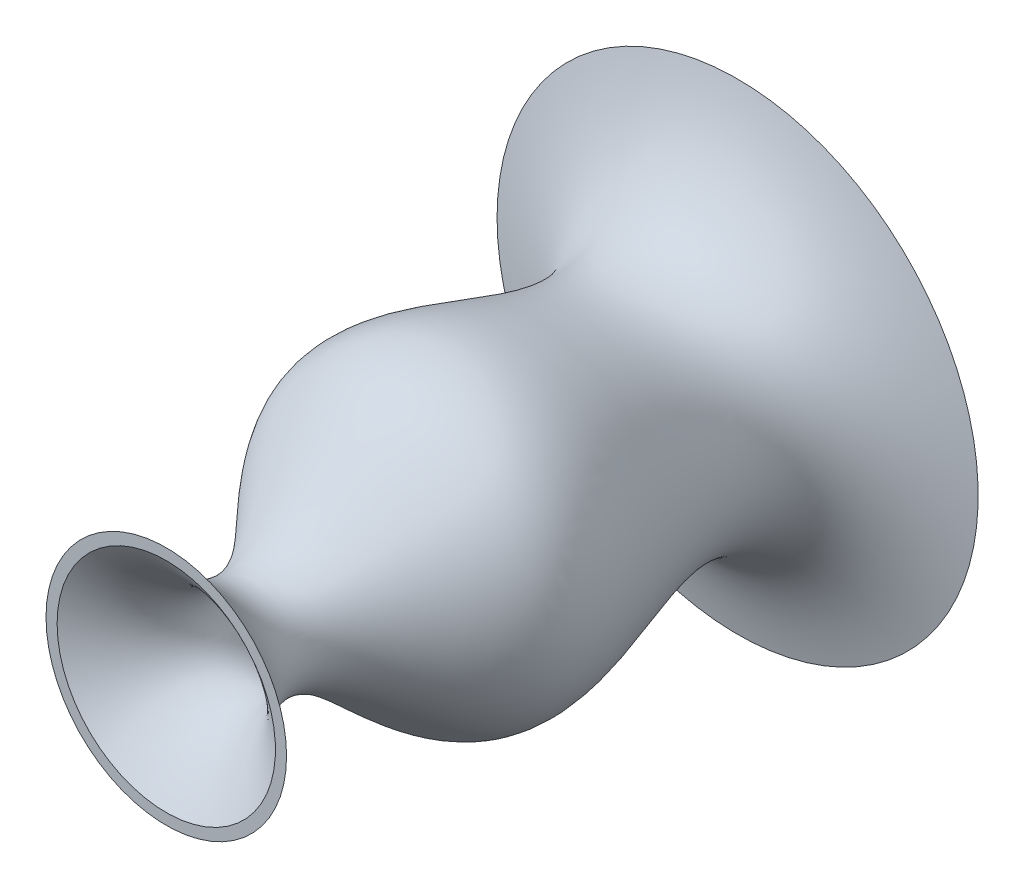
ISO-10303-21;
HEADER;
FILE_DESCRIPTION(('STEP AP214'),'2;1');
FILE_NAME('part.step','',(''),(''),'','','');
FILE_SCHEMA(('AUTOMOTIVE_DESIGN { 1 0 10303 214 1 1 1 1 }'));
ENDSEC;
DATA;
#1=APPLICATION_CONTEXT('core data for automotive mechanical design processes');
#2=APPLICATION_PROTOCOL_DEFINITION('international standard','automotive_design',2000,#1);
#3=PRODUCT_CONTEXT('',#1,'mechanical');
#4=PRODUCT('Part','Part','',(#3));
#5=PRODUCT_RELATED_PRODUCT_CATEGORY('part','',(#4));
#6=PRODUCT_DEFINITION_FORMATION('','',#4);
#7=PRODUCT_DEFINITION_CONTEXT('part definition',#1,'design');
#8=PRODUCT_DEFINITION('design','',#6,#7);
#9=PRODUCT_DEFINITION_SHAPE('','',#8);
#10=(LENGTH_UNIT() NAMED_UNIT(*) SI_UNIT(.MILLI.,.METRE.));
#11=(NAMED_UNIT(*) PLANE_ANGLE_UNIT() SI_UNIT($,.RADIAN.));
#12=(NAMED_UNIT(*) SI_UNIT($,.STERADIAN.) SOLID_ANGLE_UNIT());
#13=UNCERTAINTY_MEASURE_WITH_UNIT(LENGTH_MEASURE(1.E-05),#10,'distance_accuracy_value','');
#14=(GEOMETRIC_REPRESENTATION_CONTEXT(3) GLOBAL_UNCERTAINTY_ASSIGNED_CONTEXT((#13)) GLOBAL_UNIT_ASSIGNED_CONTEXT((#10,
#11,#12)) REPRESENTATION_CONTEXT('',''));
#15=CARTESIAN_POINT('',(0.,0.,0.));
#16=DIRECTION('',(0.,0.,1.));
#17=DIRECTION('',(1.,0.,0.));
#18=AXIS2_PLACEMENT_3D('',#15,#16,#17);
#19=CARTESIAN_POINT('',(0.,50.8,241.3));
#20=CARTESIAN_POINT('',(0.,-17.1723162395063,198.708109588688));
#21=CARTESIAN_POINT('',(0.,140.989603279236,144.448815338189));
#22=CARTESIAN_POINT('',(0.,-0.614962808046618,24.6496374591642));
#23=CARTESIAN_POINT('',(0.,101.6,0.));
#24=B_SPLINE_CURVE_WITH_KNOTS('',3,(#19,#20,#21,#22,#23),.UNSPECIFIED.,.F.,.F.,(4,1,4),(0.,
0.431374722332997,1.),.UNSPECIFIED.);
#25=CARTESIAN_POINT('',(0.,0.,0.));
#26=DIRECTION('',(0.,0.,-1.));
#27=AXIS1_PLACEMENT('',#25,#26);
#28=SURFACE_OF_REVOLUTION('',#24,#27);
#29=CARTESIAN_POINT('',(0.,0.,0.));
#30=DIRECTION('',(0.,0.,-1.));
#31=DIRECTION('',(-1.,0.,0.));
#32=AXIS2_PLACEMENT_3D('',#29,#30,#31);
#33=CIRCLE('',#32,101.6);
#34=CARTESIAN_POINT('',(-101.6,0.,0.));
#35=VERTEX_POINT('',#34);
#36=EDGE_CURVE('E51',#35,#35,#33,.T.);
#37=ORIENTED_EDGE('',*,*,#36,.F.);
#38=EDGE_LOOP('',(#37));
#39=FACE_BOUND('',#38,.T.);
#40=CARTESIAN_POINT('',(0.,0.,241.3));
#41=DIRECTION('',(0.,0.,-1.));
#42=DIRECTION('',(-1.,0.,0.));
#43=AXIS2_PLACEMENT_3D('',#40,#41,#42);
#44=CIRCLE('',#43,50.8);
#45=CARTESIAN_POINT('',(-50.8,0.,241.3));
#46=VERTEX_POINT('',#45);
#47=EDGE_CURVE('E10',#46,#46,#44,.T.);
#48=ORIENTED_EDGE('',*,*,#47,.T.);
#49=EDGE_LOOP('',(#48));
#50=FACE_BOUND('',#49,.T.);
#51=ADVANCED_FACE('F44',(#39,#50),#28,.T.);
#52=CARTESIAN_POINT('',(0.,0.,241.3));
#53=DIRECTION('',(0.,0.,-1.));
#54=DIRECTION('',(-1.,0.,0.));
#55=AXIS2_PLACEMENT_3D('',#52,#53,#54);
#56=PLANE('',#55);
#57=CARTESIAN_POINT('',(0.,0.,241.3));
#58=DIRECTION('',(0.,0.,-1.));
#59=DIRECTION('',(-1.,0.,0.));
#60=AXIS2_PLACEMENT_3D('',#57,#58,#59);
#61=CIRCLE('',#60,46.1055409688515);
#62=CARTESIAN_POINT('',(-46.1055409688515,0.,241.3));
#63=VERTEX_POINT('',#62);
#64=EDGE_CURVE('E55',#63,#63,#61,.T.);
#65=ORIENTED_EDGE('',*,*,#64,.T.);
#66=EDGE_LOOP('',(#65));
#67=FACE_BOUND('',#66,.T.);
#68=ORIENTED_EDGE('',*,*,#47,.F.);
#69=EDGE_LOOP('',(#68));
#70=FACE_BOUND('',#69,.T.);
#71=ADVANCED_FACE('F46',(#67,#70),#56,.F.);
#72=CARTESIAN_POINT('',(0.,0.,0.));
#73=DIRECTION('',(0.,0.,-1.));
#74=DIRECTION('',(-1.,0.,0.));
#75=AXIS2_PLACEMENT_3D('',#72,#73,#74);
#76=PLANE('',#75);
#77=ORIENTED_EDGE('',*,*,#36,.T.);
#78=EDGE_LOOP('',(#77));
#79=FACE_BOUND('',#78,.T.);
#80=ADVANCED_FACE('F79',(#79),#76,.T.);
#81=CARTESIAN_POINT('',(0.,50.8,241.3));
#82=CARTESIAN_POINT('',(0.,-17.1723162395063,198.708109588688));
#83=CARTESIAN_POINT('',(0.,140.989603279236,144.448815338189));
#84=CARTESIAN_POINT('',(0.,-0.614962808046618,24.6496374591642));
#85=CARTESIAN_POINT('',(0.,101.6,0.));
#86=B_SPLINE_CURVE_WITH_KNOTS('',3,(#81,#82,#83,#84,#85),.UNSPECIFIED.,.F.,.F.,(4,1,4),(0.,
0.431374722332997,1.),.UNSPECIFIED.);
#87=CARTESIAN_POINT('',(0.,0.,0.));
#88=DIRECTION('',(0.,0.,-1.));
#89=AXIS1_PLACEMENT('',#87,#88);
#90=SURFACE_OF_REVOLUTION('',#86,#89);
#91=OFFSET_SURFACE('',#90,-2.54,.F.);
#92=CARTESIAN_POINT('',(0.,0.,2.54000000000001));
#93=DIRECTION('',(0.,0.,-1.));
#94=DIRECTION('',(-1.,0.,0.));
#95=AXIS2_PLACEMENT_3D('',#92,#93,#94);
#96=CIRCLE('',#95,84.1515551545496);
#97=CARTESIAN_POINT('',(-84.1515551545496,0.,2.54000000000001));
#98=VERTEX_POINT('',#97);
#99=EDGE_CURVE('E59',#98,#98,#96,.T.);
#100=ORIENTED_EDGE('',*,*,#99,.T.);
#101=EDGE_LOOP('',(#100));
#102=FACE_BOUND('',#101,.T.);
#103=ORIENTED_EDGE('',*,*,#64,.F.);
#104=EDGE_LOOP('',(#103));
#105=FACE_BOUND('',#104,.T.);
#106=ADVANCED_FACE('F75',(#102,#105),#91,.F.);
#107=CARTESIAN_POINT('',(0.,0.,2.54));
#108=DIRECTION('',(0.,0.,-1.));
#109=DIRECTION('',(-1.,0.,0.));
#110=AXIS2_PLACEMENT_3D('',#107,#108,#109);
#111=PLANE('',#110);
#112=ORIENTED_EDGE('',*,*,#99,.F.);
#113=EDGE_LOOP('',(#112));
#114=FACE_BOUND('',#113,.T.);
#115=ADVANCED_FACE('F76',(#114),#111,.F.);
#116=CLOSED_SHELL('',(#51,#71,#80,#106,#115));
#117=MANIFOLD_SOLID_BREP('B2',#116);
#118=ADVANCED_BREP_SHAPE_REPRESENTATION('',(#18,#117),#14);
#119=SHAPE_DEFINITION_REPRESENTATION(#9,#118);
ENDSEC;
END-ISO-10303-21;
